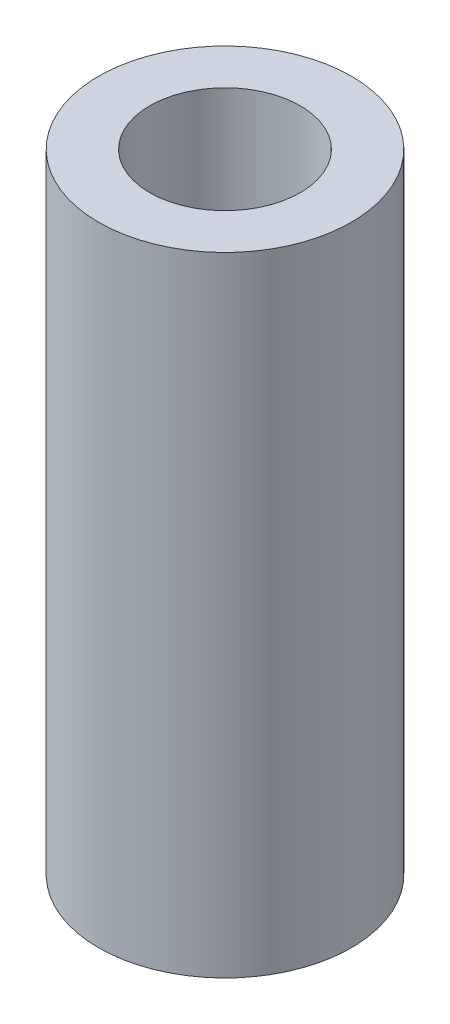
ISO-10303-21;
HEADER;
FILE_DESCRIPTION(('STEP AP214'),'2;1');
FILE_NAME('part.step','',(''),(''),'','','');
FILE_SCHEMA(('AUTOMOTIVE_DESIGN { 1 0 10303 214 1 1 1 1 }'));
ENDSEC;
DATA;
#1=APPLICATION_CONTEXT('core data for automotive mechanical design processes');
#2=APPLICATION_PROTOCOL_DEFINITION('international standard','automotive_design',2000,#1);
#3=PRODUCT_CONTEXT('',#1,'mechanical');
#4=PRODUCT('Part','Part','',(#3));
#5=PRODUCT_RELATED_PRODUCT_CATEGORY('part','',(#4));
#6=PRODUCT_DEFINITION_FORMATION('','',#4);
#7=PRODUCT_DEFINITION_CONTEXT('part definition',#1,'design');
#8=PRODUCT_DEFINITION('design','',#6,#7);
#9=PRODUCT_DEFINITION_SHAPE('','',#8);
#10=(LENGTH_UNIT() NAMED_UNIT(*) SI_UNIT(.MILLI.,.METRE.));
#11=(NAMED_UNIT(*) PLANE_ANGLE_UNIT() SI_UNIT($,.RADIAN.));
#12=(NAMED_UNIT(*) SI_UNIT($,.STERADIAN.) SOLID_ANGLE_UNIT());
#13=UNCERTAINTY_MEASURE_WITH_UNIT(LENGTH_MEASURE(1.E-05),#10,'distance_accuracy_value','');
#14=(GEOMETRIC_REPRESENTATION_CONTEXT(3) GLOBAL_UNCERTAINTY_ASSIGNED_CONTEXT((#13)) GLOBAL_UNIT_ASSIGNED_CONTEXT((#10,
#11,#12)) REPRESENTATION_CONTEXT('',''));
#15=CARTESIAN_POINT('',(0.,0.,0.));
#16=DIRECTION('',(0.,0.,1.));
#17=DIRECTION('',(1.,0.,0.));
#18=AXIS2_PLACEMENT_3D('',#15,#16,#17);
#19=CARTESIAN_POINT('',(0.,15.9,0.));
#20=DIRECTION('',(0.,-1.,0.));
#21=DIRECTION('',(0.,0.,-1.));
#22=AXIS2_PLACEMENT_3D('',#19,#20,#21);
#23=CYLINDRICAL_SURFACE('',#22,3.2);
#24=CARTESIAN_POINT('',(0.,15.9,0.));
#25=DIRECTION('',(0.,1.,0.));
#26=DIRECTION('',(0.,0.,1.));
#27=AXIS2_PLACEMENT_3D('',#24,#25,#26);
#28=CIRCLE('',#27,3.2);
#29=CARTESIAN_POINT('',(0.,15.9,3.2));
#30=VERTEX_POINT('',#29);
#31=EDGE_CURVE('E10',#30,#30,#28,.T.);
#32=ORIENTED_EDGE('',*,*,#31,.F.);
#33=EDGE_LOOP('',(#32));
#34=FACE_BOUND('',#33,.T.);
#35=CARTESIAN_POINT('',(0.,0.,0.));
#36=DIRECTION('',(0.,1.,0.));
#37=DIRECTION('',(0.,0.,1.));
#38=AXIS2_PLACEMENT_3D('',#35,#36,#37);
#39=CIRCLE('',#38,3.2);
#40=CARTESIAN_POINT('',(0.,0.,3.2));
#41=VERTEX_POINT('',#40);
#42=EDGE_CURVE('E34',#41,#41,#39,.T.);
#43=ORIENTED_EDGE('',*,*,#42,.T.);
#44=EDGE_LOOP('',(#43));
#45=FACE_BOUND('',#44,.T.);
#46=ADVANCED_FACE('F31',(#34,#45),#23,.T.);
#47=CARTESIAN_POINT('',(0.,15.9,0.));
#48=DIRECTION('',(0.,1.,0.));
#49=DIRECTION('',(0.,0.,1.));
#50=AXIS2_PLACEMENT_3D('',#47,#48,#49);
#51=PLANE('',#50);
#52=CARTESIAN_POINT('',(0.,15.9,0.));
#53=DIRECTION('',(0.,1.,0.));
#54=DIRECTION('',(0.,0.,1.));
#55=AXIS2_PLACEMENT_3D('',#52,#53,#54);
#56=CIRCLE('',#55,1.905);
#57=CARTESIAN_POINT('',(0.,15.9,1.905));
#58=VERTEX_POINT('',#57);
#59=EDGE_CURVE('E43',#58,#58,#56,.T.);
#60=ORIENTED_EDGE('',*,*,#59,.F.);
#61=EDGE_LOOP('',(#60));
#62=FACE_BOUND('',#61,.T.);
#63=ORIENTED_EDGE('',*,*,#31,.T.);
#64=EDGE_LOOP('',(#63));
#65=FACE_BOUND('',#64,.T.);
#66=ADVANCED_FACE('F58',(#62,#65),#51,.T.);
#67=CARTESIAN_POINT('',(0.,0.,0.));
#68=DIRECTION('',(0.,1.,0.));
#69=DIRECTION('',(0.,0.,1.));
#70=AXIS2_PLACEMENT_3D('',#67,#68,#69);
#71=PLANE('',#70);
#72=CARTESIAN_POINT('',(0.,0.,0.));
#73=DIRECTION('',(0.,1.,0.));
#74=DIRECTION('',(0.,0.,1.));
#75=AXIS2_PLACEMENT_3D('',#72,#73,#74);
#76=CIRCLE('',#75,1.905);
#77=CARTESIAN_POINT('',(0.,0.,1.905));
#78=VERTEX_POINT('',#77);
#79=EDGE_CURVE('E41',#78,#78,#76,.T.);
#80=ORIENTED_EDGE('',*,*,#79,.T.);
#81=EDGE_LOOP('',(#80));
#82=FACE_BOUND('',#81,.T.);
#83=ORIENTED_EDGE('',*,*,#42,.F.);
#84=EDGE_LOOP('',(#83));
#85=FACE_BOUND('',#84,.T.);
#86=ADVANCED_FACE('F49',(#82,#85),#71,.F.);
#87=CARTESIAN_POINT('',(0.,0.,0.));
#88=DIRECTION('',(0.,1.,0.));
#89=DIRECTION('',(0.,0.,1.));
#90=AXIS2_PLACEMENT_3D('',#87,#88,#89);
#91=CYLINDRICAL_SURFACE('',#90,1.905);
#92=ORIENTED_EDGE('',*,*,#79,.F.);
#93=EDGE_LOOP('',(#92));
#94=FACE_BOUND('',#93,.T.);
#95=ORIENTED_EDGE('',*,*,#59,.T.);
#96=EDGE_LOOP('',(#95));
#97=FACE_BOUND('',#96,.T.);
#98=ADVANCED_FACE('F52',(#94,#97),#91,.F.);
#99=CLOSED_SHELL('',(#46,#66,#86,#98));
#100=MANIFOLD_SOLID_BREP('B2',#99);
#101=ADVANCED_BREP_SHAPE_REPRESENTATION('',(#18,#100),#14);
#102=SHAPE_DEFINITION_REPRESENTATION(#9,#101);
ENDSEC;
END-ISO-10303-21;
